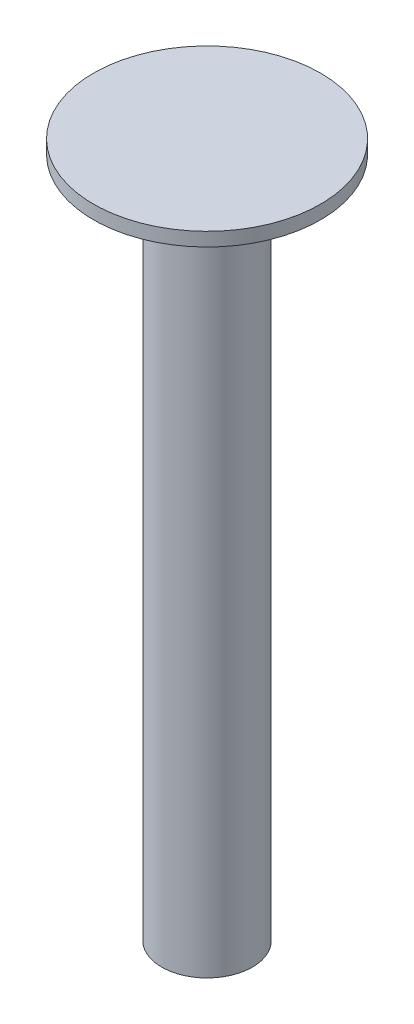
ISO-10303-21;
HEADER;
FILE_DESCRIPTION(('STEP AP214'),'2;1');
FILE_NAME('part.step','',(''),(''),'','','');
FILE_SCHEMA(('AUTOMOTIVE_DESIGN { 1 0 10303 214 1 1 1 1 }'));
ENDSEC;
DATA;
#1=APPLICATION_CONTEXT('core data for automotive mechanical design processes');
#2=APPLICATION_PROTOCOL_DEFINITION('international standard','automotive_design',2000,#1);
#3=PRODUCT_CONTEXT('',#1,'mechanical');
#4=PRODUCT('Part','Part','',(#3));
#5=PRODUCT_RELATED_PRODUCT_CATEGORY('part','',(#4));
#6=PRODUCT_DEFINITION_FORMATION('','',#4);
#7=PRODUCT_DEFINITION_CONTEXT('part definition',#1,'design');
#8=PRODUCT_DEFINITION('design','',#6,#7);
#9=PRODUCT_DEFINITION_SHAPE('','',#8);
#10=(LENGTH_UNIT() NAMED_UNIT(*) SI_UNIT(.MILLI.,.METRE.));
#11=(NAMED_UNIT(*) PLANE_ANGLE_UNIT() SI_UNIT($,.RADIAN.));
#12=(NAMED_UNIT(*) SI_UNIT($,.STERADIAN.) SOLID_ANGLE_UNIT());
#13=UNCERTAINTY_MEASURE_WITH_UNIT(LENGTH_MEASURE(1.E-05),#10,'distance_accuracy_value','');
#14=(GEOMETRIC_REPRESENTATION_CONTEXT(3) GLOBAL_UNCERTAINTY_ASSIGNED_CONTEXT((#13)) GLOBAL_UNIT_ASSIGNED_CONTEXT((#10,
#11,#12)) REPRESENTATION_CONTEXT('',''));
#15=CARTESIAN_POINT('',(0.,0.,0.));
#16=DIRECTION('',(0.,0.,1.));
#17=DIRECTION('',(1.,0.,0.));
#18=AXIS2_PLACEMENT_3D('',#15,#16,#17);
#19=CARTESIAN_POINT('',(0.,76.2,0.));
#20=DIRECTION('',(0.,-1.,0.));
#21=DIRECTION('',(0.,0.,-1.));
#22=AXIS2_PLACEMENT_3D('',#19,#20,#21);
#23=CYLINDRICAL_SURFACE('',#22,5.08);
#24=CARTESIAN_POINT('',(0.,76.2,0.));
#25=DIRECTION('',(0.,1.,0.));
#26=DIRECTION('',(0.,0.,1.));
#27=AXIS2_PLACEMENT_3D('',#24,#25,#26);
#28=CIRCLE('',#27,5.08);
#29=CARTESIAN_POINT('',(0.,76.2,-5.08));
#30=VERTEX_POINT('',#29);
#31=EDGE_CURVE('E10',#30,#30,#28,.T.);
#32=CARTESIAN_POINT('',(0.,0.,0.));
#33=DIRECTION('',(0.,1.,0.));
#34=DIRECTION('',(0.,0.,1.));
#35=AXIS2_PLACEMENT_3D('',#32,#33,#34);
#36=CIRCLE('',#35,5.08);
#37=CARTESIAN_POINT('',(0.,0.,-5.08));
#38=VERTEX_POINT('',#37);
#39=EDGE_CURVE('E42',#38,#38,#36,.T.);
#40=CARTESIAN_POINT('',(0.,76.2,-5.08));
#41=CARTESIAN_POINT('',(0.,75.40625,-5.08));
#42=CARTESIAN_POINT('',(0.,74.6125,-5.08));
#43=CARTESIAN_POINT('',(0.,73.025,-5.08));
#44=CARTESIAN_POINT('',(0.,72.23125,-5.08));
#45=CARTESIAN_POINT('',(0.,70.64375,-5.08));
#46=CARTESIAN_POINT('',(0.,69.85,-5.08));
#47=CARTESIAN_POINT('',(0.,68.2625,-5.08));
#48=CARTESIAN_POINT('',(0.,67.46875,-5.08));
#49=CARTESIAN_POINT('',(0.,65.88125,-5.08));
#50=CARTESIAN_POINT('',(0.,65.0875,-5.08));
#51=CARTESIAN_POINT('',(0.,63.5,-5.08));
#52=CARTESIAN_POINT('',(0.,62.70625,-5.08));
#53=CARTESIAN_POINT('',(0.,61.11875,-5.08));
#54=CARTESIAN_POINT('',(0.,60.325,-5.08));
#55=CARTESIAN_POINT('',(0.,58.7375,-5.08));
#56=CARTESIAN_POINT('',(0.,57.94375,-5.08));
#57=CARTESIAN_POINT('',(0.,56.35625,-5.08));
#58=CARTESIAN_POINT('',(0.,55.5625,-5.08));
#59=CARTESIAN_POINT('',(0.,53.975,-5.08));
#60=CARTESIAN_POINT('',(0.,53.18125,-5.08));
#61=CARTESIAN_POINT('',(0.,51.59375,-5.08));
#62=CARTESIAN_POINT('',(0.,50.8,-5.08));
#63=CARTESIAN_POINT('',(0.,49.2125,-5.08));
#64=CARTESIAN_POINT('',(0.,48.41875,-5.08));
#65=CARTESIAN_POINT('',(0.,46.83125,-5.08));
#66=CARTESIAN_POINT('',(0.,46.0375,-5.08));
#67=CARTESIAN_POINT('',(0.,44.45,-5.08));
#68=CARTESIAN_POINT('',(0.,43.65625,-5.08));
#69=CARTESIAN_POINT('',(0.,42.06875,-5.08));
#70=CARTESIAN_POINT('',(0.,41.275,-5.08));
#71=CARTESIAN_POINT('',(0.,39.6875,-5.08));
#72=CARTESIAN_POINT('',(0.,38.89375,-5.08));
#73=CARTESIAN_POINT('',(0.,37.30625,-5.08));
#74=CARTESIAN_POINT('',(0.,36.5125,-5.08));
#75=CARTESIAN_POINT('',(0.,34.925,-5.08));
#76=CARTESIAN_POINT('',(0.,34.13125,-5.08));
#77=CARTESIAN_POINT('',(0.,32.54375,-5.08));
#78=CARTESIAN_POINT('',(0.,31.75,-5.08));
#79=CARTESIAN_POINT('',(0.,30.1625,-5.08));
#80=CARTESIAN_POINT('',(0.,29.36875,-5.08));
#81=CARTESIAN_POINT('',(0.,27.78125,-5.08));
#82=CARTESIAN_POINT('',(0.,26.9875,-5.08));
#83=CARTESIAN_POINT('',(0.,25.4,-5.08));
#84=CARTESIAN_POINT('',(0.,24.60625,-5.08));
#85=CARTESIAN_POINT('',(0.,23.01875,-5.08));
#86=CARTESIAN_POINT('',(0.,22.225,-5.08));
#87=CARTESIAN_POINT('',(0.,20.6375,-5.08));
#88=CARTESIAN_POINT('',(0.,19.84375,-5.08));
#89=CARTESIAN_POINT('',(0.,18.25625,-5.08));
#90=CARTESIAN_POINT('',(0.,17.4625,-5.08));
#91=CARTESIAN_POINT('',(0.,15.875,-5.08));
#92=CARTESIAN_POINT('',(0.,15.08125,-5.08));
#93=CARTESIAN_POINT('',(0.,13.49375,-5.08));
#94=CARTESIAN_POINT('',(0.,12.7,-5.08));
#95=CARTESIAN_POINT('',(0.,11.1125,-5.08));
#96=CARTESIAN_POINT('',(0.,10.31875,-5.08));
#97=CARTESIAN_POINT('',(0.,8.73125,-5.08));
#98=CARTESIAN_POINT('',(0.,7.93750000000001,-5.08));
#99=CARTESIAN_POINT('',(0.,6.35,-5.08));
#100=CARTESIAN_POINT('',(0.,5.55625,-5.08));
#101=CARTESIAN_POINT('',(0.,3.96875,-5.08));
#102=CARTESIAN_POINT('',(0.,3.175,-5.08));
#103=CARTESIAN_POINT('',(0.,1.5875,-5.08));
#104=CARTESIAN_POINT('',(0.,0.793750000000001,-5.08));
#105=CARTESIAN_POINT('',(0.,0.,-5.08));
#106=B_SPLINE_CURVE_WITH_KNOTS('',3,(#40,#41,#42,#43,#44,#45,#46,#47,#48,#49,#50,#51,#52,#53,
#54,#55,#56,#57,#58,#59,#60,#61,#62,#63,#64,#65,#66,#67,#68,#69,#70,#71,#72,#73,#74,#75,#76,#77,
#78,#79,#80,#81,#82,#83,#84,#85,#86,#87,#88,#89,#90,#91,#92,#93,#94,#95,#96,#97,#98,#99,#100,
#101,#102,#103,#104,#105),.UNSPECIFIED.,.F.,.F.,(4,2,2,2,2,2,2,2,2,2,2,2,2,2,2,2,2,2,2,2,2,2,2,
2,2,2,2,2,2,2,2,2,4),(0.,2.38124999999999,4.76249999999999,7.14374999999999,9.52499999999999,
11.90625,14.2875,16.66875,19.05,21.43125,23.8125,26.19375,28.575,30.95625,33.3375,35.71875,38.1,
40.48125,42.8625,45.24375,47.625,50.00625,52.3875,54.76875,57.15,59.53125,61.9125,64.29375,
66.675,69.05625,71.4375,73.81875,76.2),.UNSPECIFIED.);
#107=EDGE_CURVE('BSEAM39',#30,#38,#106,.T.);
#108=ORIENTED_EDGE('',*,*,#31,.F.);
#109=ORIENTED_EDGE('',*,*,#39,.T.);
#110=ORIENTED_EDGE('',*,*,#107,.T.);
#111=ORIENTED_EDGE('',*,*,#107,.F.);
#112=EDGE_LOOP('',(#108,#110,#109,#111));
#113=FACE_BOUND('',#112,.T.);
#114=ADVANCED_FACE('F39',(#113),#23,.T.);
#115=CARTESIAN_POINT('',(0.,0.,0.));
#116=DIRECTION('',(0.,1.,0.));
#117=DIRECTION('',(0.,0.,1.));
#118=AXIS2_PLACEMENT_3D('',#115,#116,#117);
#119=PLANE('',#118);
#120=ORIENTED_EDGE('',*,*,#39,.F.);
#121=EDGE_LOOP('',(#120));
#122=FACE_BOUND('',#121,.T.);
#123=ADVANCED_FACE('F62',(#122),#119,.F.);
#124=CARTESIAN_POINT('',(0.,77.724,0.));
#125=DIRECTION('',(0.,-1.,0.));
#126=DIRECTION('',(0.,0.,-1.));
#127=AXIS2_PLACEMENT_3D('',#124,#125,#126);
#128=CYLINDRICAL_SURFACE('',#127,12.7);
#129=CARTESIAN_POINT('',(0.,77.724,0.));
#130=DIRECTION('',(0.,1.,0.));
#131=DIRECTION('',(0.,0.,1.));
#132=AXIS2_PLACEMENT_3D('',#129,#130,#131);
#133=CIRCLE('',#132,12.7);
#134=CARTESIAN_POINT('',(0.,77.724,-12.7));
#135=VERTEX_POINT('',#134);
#136=EDGE_CURVE('E49',#135,#135,#133,.T.);
#137=CARTESIAN_POINT('',(0.,76.2,0.));
#138=DIRECTION('',(0.,1.,0.));
#139=DIRECTION('',(0.,0.,1.));
#140=AXIS2_PLACEMENT_3D('',#137,#138,#139);
#141=CIRCLE('',#140,12.7);
#142=CARTESIAN_POINT('',(0.,76.2,-12.7));
#143=VERTEX_POINT('',#142);
#144=EDGE_CURVE('E51',#143,#143,#141,.T.);
#145=CARTESIAN_POINT('',(0.,77.724,-12.7));
#146=CARTESIAN_POINT('',(0.,77.708125,-12.7));
#147=CARTESIAN_POINT('',(0.,77.69225,-12.7));
#148=CARTESIAN_POINT('',(0.,77.6605,-12.7));
#149=CARTESIAN_POINT('',(0.,77.644625,-12.7));
#150=CARTESIAN_POINT('',(0.,77.612875,-12.7));
#151=CARTESIAN_POINT('',(0.,77.597,-12.7));
#152=CARTESIAN_POINT('',(0.,77.56525,-12.7));
#153=CARTESIAN_POINT('',(0.,77.549375,-12.7));
#154=CARTESIAN_POINT('',(0.,77.517625,-12.7));
#155=CARTESIAN_POINT('',(0.,77.50175,-12.7));
#156=CARTESIAN_POINT('',(0.,77.47,-12.7));
#157=CARTESIAN_POINT('',(0.,77.454125,-12.7));
#158=CARTESIAN_POINT('',(0.,77.422375,-12.7));
#159=CARTESIAN_POINT('',(0.,77.4065,-12.7));
#160=CARTESIAN_POINT('',(0.,77.37475,-12.7));
#161=CARTESIAN_POINT('',(0.,77.358875,-12.7));
#162=CARTESIAN_POINT('',(0.,77.327125,-12.7));
#163=CARTESIAN_POINT('',(0.,77.31125,-12.7));
#164=CARTESIAN_POINT('',(0.,77.2795,-12.7));
#165=CARTESIAN_POINT('',(0.,77.263625,-12.7));
#166=CARTESIAN_POINT('',(0.,77.231875,-12.7));
#167=CARTESIAN_POINT('',(0.,77.216,-12.7));
#168=CARTESIAN_POINT('',(0.,77.18425,-12.7));
#169=CARTESIAN_POINT('',(0.,77.168375,-12.7));
#170=CARTESIAN_POINT('',(0.,77.136625,-12.7));
#171=CARTESIAN_POINT('',(0.,77.12075,-12.7));
#172=CARTESIAN_POINT('',(0.,77.089,-12.7));
#173=CARTESIAN_POINT('',(0.,77.073125,-12.7));
#174=CARTESIAN_POINT('',(0.,77.041375,-12.7));
#175=CARTESIAN_POINT('',(0.,77.0255,-12.7));
#176=CARTESIAN_POINT('',(0.,76.99375,-12.7));
#177=CARTESIAN_POINT('',(0.,76.977875,-12.7));
#178=CARTESIAN_POINT('',(0.,76.946125,-12.7));
#179=CARTESIAN_POINT('',(0.,76.93025,-12.7));
#180=CARTESIAN_POINT('',(0.,76.8985,-12.7));
#181=CARTESIAN_POINT('',(0.,76.882625,-12.7));
#182=CARTESIAN_POINT('',(0.,76.850875,-12.7));
#183=CARTESIAN_POINT('',(0.,76.835,-12.7));
#184=CARTESIAN_POINT('',(0.,76.80325,-12.7));
#185=CARTESIAN_POINT('',(0.,76.787375,-12.7));
#186=CARTESIAN_POINT('',(0.,76.755625,-12.7));
#187=CARTESIAN_POINT('',(0.,76.73975,-12.7));
#188=CARTESIAN_POINT('',(0.,76.708,-12.7));
#189=CARTESIAN_POINT('',(0.,76.692125,-12.7));
#190=CARTESIAN_POINT('',(0.,76.660375,-12.7));
#191=CARTESIAN_POINT('',(0.,76.6445,-12.7));
#192=CARTESIAN_POINT('',(0.,76.61275,-12.7));
#193=CARTESIAN_POINT('',(0.,76.596875,-12.7));
#194=CARTESIAN_POINT('',(0.,76.565125,-12.7));
#195=CARTESIAN_POINT('',(0.,76.54925,-12.7));
#196=CARTESIAN_POINT('',(0.,76.5175,-12.7));
#197=CARTESIAN_POINT('',(0.,76.501625,-12.7));
#198=CARTESIAN_POINT('',(0.,76.469875,-12.7));
#199=CARTESIAN_POINT('',(0.,76.454,-12.7));
#200=CARTESIAN_POINT('',(0.,76.42225,-12.7));
#201=CARTESIAN_POINT('',(0.,76.406375,-12.7));
#202=CARTESIAN_POINT('',(0.,76.374625,-12.7));
#203=CARTESIAN_POINT('',(0.,76.35875,-12.7));
#204=CARTESIAN_POINT('',(0.,76.327,-12.7));
#205=CARTESIAN_POINT('',(0.,76.311125,-12.7));
#206=CARTESIAN_POINT('',(0.,76.279375,-12.7));
#207=CARTESIAN_POINT('',(0.,76.2635,-12.7));
#208=CARTESIAN_POINT('',(0.,76.23175,-12.7));
#209=CARTESIAN_POINT('',(0.,76.215875,-12.7));
#210=CARTESIAN_POINT('',(0.,76.2,-12.7));
#211=B_SPLINE_CURVE_WITH_KNOTS('',3,(#145,#146,#147,#148,#149,#150,#151,#152,#153,#154,#155,
#156,#157,#158,#159,#160,#161,#162,#163,#164,#165,#166,#167,#168,#169,#170,#171,#172,#173,#174,
#175,#176,#177,#178,#179,#180,#181,#182,#183,#184,#185,#186,#187,#188,#189,#190,#191,#192,#193,
#194,#195,#196,#197,#198,#199,#200,#201,#202,#203,#204,#205,#206,#207,#208,#209,#210),
.UNSPECIFIED.,.F.,.F.,(4,2,2,2,2,2,2,2,2,2,2,2,2,2,2,2,2,2,2,2,2,2,2,2,2,2,2,2,2,2,2,2,4),(0.,
0.0476249999999956,0.0952499999999912,0.142874999999987,0.190499999999996,0.238124999999992,
0.285749999999987,0.333374999999997,0.380999999999992,0.428624999999988,0.476249999999998,
0.523874999999993,0.571499999999989,0.619124999999998,0.666749999999994,0.714374999999989,
0.761999999999985,0.809624999999994,0.85724999999999,0.904874999999986,0.952499999999995,
1.00012499999999,1.04774999999999,1.095375,1.14299999999999,1.19062499999999,1.23825,
1.28587499999999,1.33349999999999,1.381125,1.42874999999999,1.47637499999999,1.52399999999998),.UNSPECIFIED.);
#212=EDGE_CURVE('BSEAM59',#135,#143,#211,.T.);
#213=ORIENTED_EDGE('',*,*,#136,.F.);
#214=ORIENTED_EDGE('',*,*,#144,.T.);
#215=ORIENTED_EDGE('',*,*,#212,.T.);
#216=ORIENTED_EDGE('',*,*,#212,.F.);
#217=EDGE_LOOP('',(#213,#215,#214,#216));
#218=FACE_BOUND('',#217,.T.);
#219=ADVANCED_FACE('F59',(#218),#128,.T.);
#220=CARTESIAN_POINT('',(0.,77.724,0.));
#221=DIRECTION('',(0.,1.,0.));
#222=DIRECTION('',(0.,0.,1.));
#223=AXIS2_PLACEMENT_3D('',#220,#221,#222);
#224=PLANE('',#223);
#225=ORIENTED_EDGE('',*,*,#136,.T.);
#226=EDGE_LOOP('',(#225));
#227=FACE_BOUND('',#226,.T.);
#228=ADVANCED_FACE('F57',(#227),#224,.T.);
#229=CARTESIAN_POINT('',(0.,76.2,0.));
#230=DIRECTION('',(0.,1.,0.));
#231=DIRECTION('',(0.,0.,1.));
#232=AXIS2_PLACEMENT_3D('',#229,#230,#231);
#233=PLANE('',#232);
#234=ORIENTED_EDGE('',*,*,#31,.T.);
#235=EDGE_LOOP('',(#234));
#236=FACE_BOUND('',#235,.T.);
#237=ORIENTED_EDGE('',*,*,#144,.F.);
#238=EDGE_LOOP('',(#237));
#239=FACE_BOUND('',#238,.T.);
#240=ADVANCED_FACE('F66',(#236,#239),#233,.F.);
#241=CLOSED_SHELL('',(#114,#123,#219,#228,#240));
#242=MANIFOLD_SOLID_BREP('B2',#241);
#243=ADVANCED_BREP_SHAPE_REPRESENTATION('',(#18,#242),#14);
#244=SHAPE_DEFINITION_REPRESENTATION(#9,#243);
ENDSEC;
END-ISO-10303-21;
